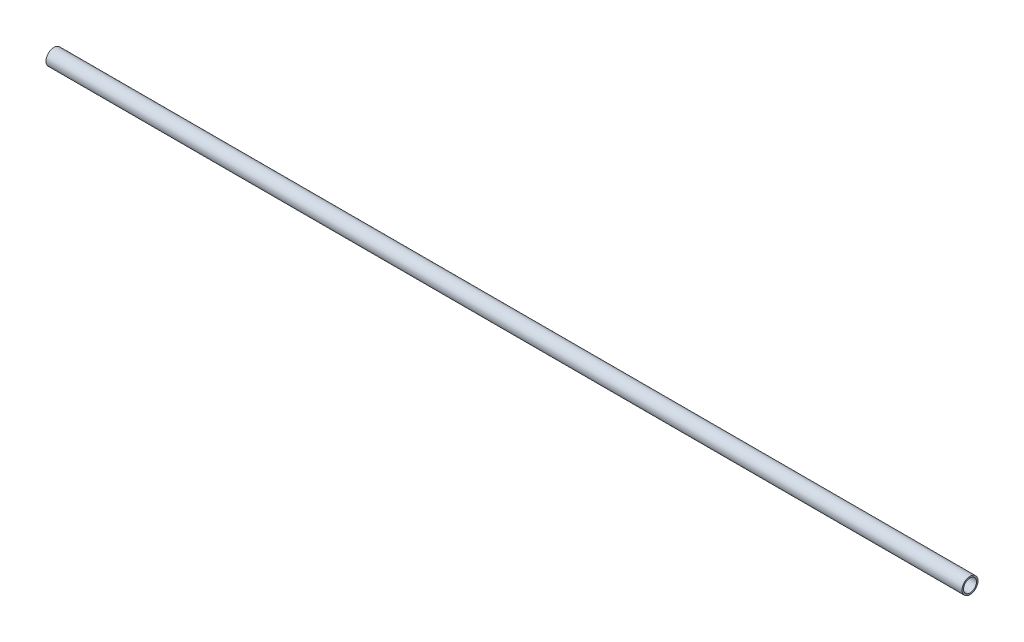
ISO-10303-21;
HEADER;
FILE_DESCRIPTION(('STEP AP214'),'2;1');
FILE_NAME('part.step','',(''),(''),'','','');
FILE_SCHEMA(('AUTOMOTIVE_DESIGN { 1 0 10303 214 1 1 1 1 }'));
ENDSEC;
DATA;
#1=APPLICATION_CONTEXT('core data for automotive mechanical design processes');
#2=APPLICATION_PROTOCOL_DEFINITION('international standard','automotive_design',2000,#1);
#3=PRODUCT_CONTEXT('',#1,'mechanical');
#4=PRODUCT('Part','Part','',(#3));
#5=PRODUCT_RELATED_PRODUCT_CATEGORY('part','',(#4));
#6=PRODUCT_DEFINITION_FORMATION('','',#4);
#7=PRODUCT_DEFINITION_CONTEXT('part definition',#1,'design');
#8=PRODUCT_DEFINITION('design','',#6,#7);
#9=PRODUCT_DEFINITION_SHAPE('','',#8);
#10=(LENGTH_UNIT() NAMED_UNIT(*) SI_UNIT(.MILLI.,.METRE.));
#11=(NAMED_UNIT(*) PLANE_ANGLE_UNIT() SI_UNIT($,.RADIAN.));
#12=(NAMED_UNIT(*) SI_UNIT($,.STERADIAN.) SOLID_ANGLE_UNIT());
#13=UNCERTAINTY_MEASURE_WITH_UNIT(LENGTH_MEASURE(1.E-05),#10,'distance_accuracy_value','');
#14=(GEOMETRIC_REPRESENTATION_CONTEXT(3) GLOBAL_UNCERTAINTY_ASSIGNED_CONTEXT((#13)) GLOBAL_UNIT_ASSIGNED_CONTEXT((#10,
#11,#12)) REPRESENTATION_CONTEXT('',''));
#15=CARTESIAN_POINT('',(0.,0.,0.));
#16=DIRECTION('',(0.,0.,1.));
#17=DIRECTION('',(1.,0.,0.));
#18=AXIS2_PLACEMENT_3D('',#15,#16,#17);
#19=CARTESIAN_POINT('',(-215.9,0.,0.));
#20=DIRECTION('',(1.,0.,0.));
#21=DIRECTION('',(0.,0.,-1.));
#22=AXIS2_PLACEMENT_3D('',#19,#20,#21);
#23=CYLINDRICAL_SURFACE('',#22,3.7592);
#24=CARTESIAN_POINT('',(-215.9,0.,0.));
#25=DIRECTION('',(1.,0.,0.));
#26=DIRECTION('',(0.,0.,-1.));
#27=AXIS2_PLACEMENT_3D('',#24,#25,#26);
#28=CIRCLE('',#27,3.7592);
#29=CARTESIAN_POINT('',(-215.9,0.,-3.7592));
#30=VERTEX_POINT('',#29);
#31=EDGE_CURVE('E10',#30,#30,#28,.T.);
#32=ORIENTED_EDGE('',*,*,#31,.T.);
#33=EDGE_LOOP('',(#32));
#34=FACE_BOUND('',#33,.T.);
#35=CARTESIAN_POINT('',(215.9,0.,0.));
#36=DIRECTION('',(1.,0.,0.));
#37=DIRECTION('',(0.,0.,-1.));
#38=AXIS2_PLACEMENT_3D('',#35,#36,#37);
#39=CIRCLE('',#38,3.7592);
#40=CARTESIAN_POINT('',(215.9,0.,-3.7592));
#41=VERTEX_POINT('',#40);
#42=EDGE_CURVE('E41',#41,#41,#39,.T.);
#43=ORIENTED_EDGE('',*,*,#42,.F.);
#44=EDGE_LOOP('',(#43));
#45=FACE_BOUND('',#44,.T.);
#46=ADVANCED_FACE('F31',(#34,#45),#23,.T.);
#47=CARTESIAN_POINT('',(-215.9,0.,0.));
#48=DIRECTION('',(1.,0.,0.));
#49=DIRECTION('',(0.,0.,-1.));
#50=AXIS2_PLACEMENT_3D('',#47,#48,#49);
#51=PLANE('',#50);
#52=CARTESIAN_POINT('',(-215.9,0.,0.));
#53=DIRECTION('',(1.,0.,0.));
#54=DIRECTION('',(0.,0.,-1.));
#55=AXIS2_PLACEMENT_3D('',#52,#53,#54);
#56=CIRCLE('',#55,3.048);
#57=CARTESIAN_POINT('',(-215.9,0.,-3.048));
#58=VERTEX_POINT('',#57);
#59=EDGE_CURVE('E37',#58,#58,#56,.T.);
#60=ORIENTED_EDGE('',*,*,#59,.T.);
#61=EDGE_LOOP('',(#60));
#62=FACE_BOUND('',#61,.T.);
#63=ORIENTED_EDGE('',*,*,#31,.F.);
#64=EDGE_LOOP('',(#63));
#65=FACE_BOUND('',#64,.T.);
#66=ADVANCED_FACE('F60',(#62,#65),#51,.F.);
#67=CARTESIAN_POINT('',(-215.9,0.,0.));
#68=DIRECTION('',(1.,0.,0.));
#69=DIRECTION('',(0.,0.,-1.));
#70=AXIS2_PLACEMENT_3D('',#67,#68,#69);
#71=CYLINDRICAL_SURFACE('',#70,3.048);
#72=ORIENTED_EDGE('',*,*,#59,.F.);
#73=EDGE_LOOP('',(#72));
#74=FACE_BOUND('',#73,.T.);
#75=CARTESIAN_POINT('',(215.9,0.,0.));
#76=DIRECTION('',(1.,0.,0.));
#77=DIRECTION('',(0.,0.,-1.));
#78=AXIS2_PLACEMENT_3D('',#75,#76,#77);
#79=CIRCLE('',#78,3.048);
#80=CARTESIAN_POINT('',(215.9,0.,-3.048));
#81=VERTEX_POINT('',#80);
#82=EDGE_CURVE('E45',#81,#81,#79,.T.);
#83=ORIENTED_EDGE('',*,*,#82,.T.);
#84=EDGE_LOOP('',(#83));
#85=FACE_BOUND('',#84,.T.);
#86=ADVANCED_FACE('F51',(#74,#85),#71,.F.);
#87=CARTESIAN_POINT('',(215.9,0.,0.));
#88=DIRECTION('',(1.,0.,0.));
#89=DIRECTION('',(0.,0.,-1.));
#90=AXIS2_PLACEMENT_3D('',#87,#88,#89);
#91=PLANE('',#90);
#92=ORIENTED_EDGE('',*,*,#42,.T.);
#93=EDGE_LOOP('',(#92));
#94=FACE_BOUND('',#93,.T.);
#95=ORIENTED_EDGE('',*,*,#82,.F.);
#96=EDGE_LOOP('',(#95));
#97=FACE_BOUND('',#96,.T.);
#98=ADVANCED_FACE('F53',(#94,#97),#91,.T.);
#99=CLOSED_SHELL('',(#46,#66,#86,#98));
#100=MANIFOLD_SOLID_BREP('B2',#99);
#101=ADVANCED_BREP_SHAPE_REPRESENTATION('',(#18,#100),#14);
#102=SHAPE_DEFINITION_REPRESENTATION(#9,#101);
ENDSEC;
END-ISO-10303-21;
